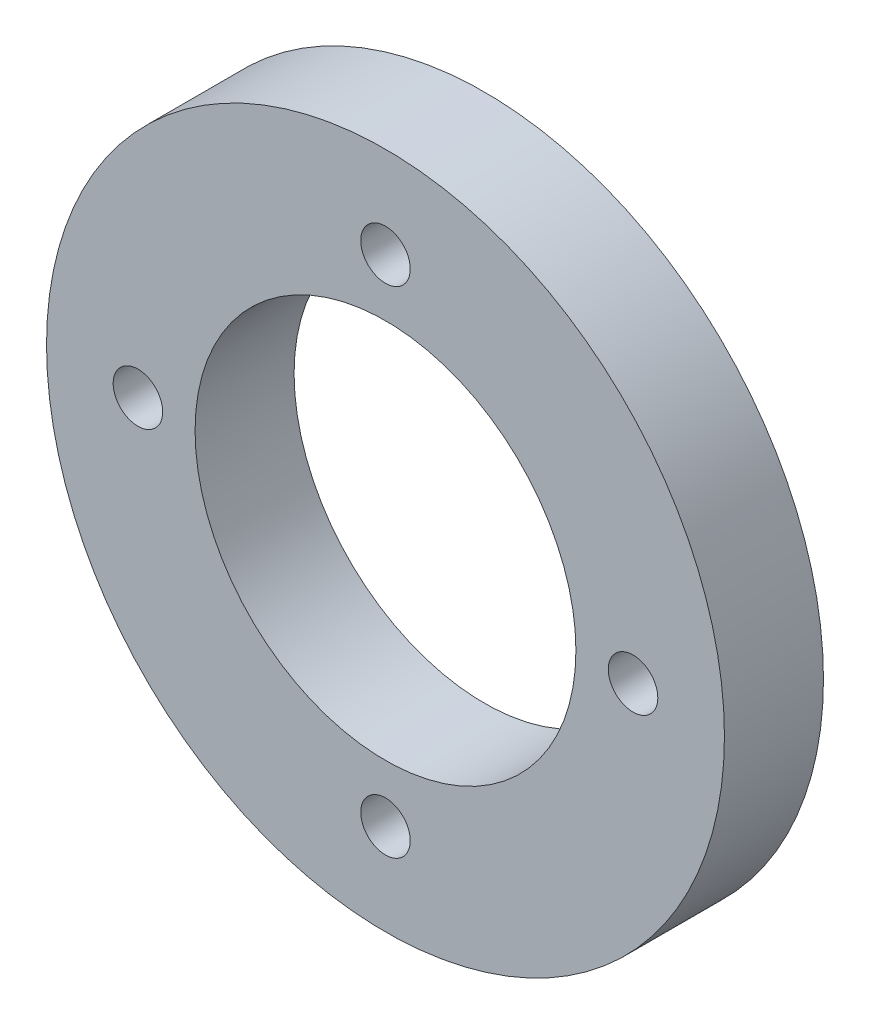
ISO-10303-21;
HEADER;
FILE_DESCRIPTION(('STEP AP214'),'2;1');
FILE_NAME('part.step','',(''),(''),'','','');
FILE_SCHEMA(('AUTOMOTIVE_DESIGN { 1 0 10303 214 1 1 1 1 }'));
ENDSEC;
DATA;
#1=APPLICATION_CONTEXT('core data for automotive mechanical design processes');
#2=APPLICATION_PROTOCOL_DEFINITION('international standard','automotive_design',2000,#1);
#3=PRODUCT_CONTEXT('',#1,'mechanical');
#4=PRODUCT('Part','Part','',(#3));
#5=PRODUCT_RELATED_PRODUCT_CATEGORY('part','',(#4));
#6=PRODUCT_DEFINITION_FORMATION('','',#4);
#7=PRODUCT_DEFINITION_CONTEXT('part definition',#1,'design');
#8=PRODUCT_DEFINITION('design','',#6,#7);
#9=PRODUCT_DEFINITION_SHAPE('','',#8);
#10=(LENGTH_UNIT() NAMED_UNIT(*) SI_UNIT(.MILLI.,.METRE.));
#11=(NAMED_UNIT(*) PLANE_ANGLE_UNIT() SI_UNIT($,.RADIAN.));
#12=(NAMED_UNIT(*) SI_UNIT($,.STERADIAN.) SOLID_ANGLE_UNIT());
#13=UNCERTAINTY_MEASURE_WITH_UNIT(LENGTH_MEASURE(1.E-05),#10,'distance_accuracy_value','');
#14=(GEOMETRIC_REPRESENTATION_CONTEXT(3) GLOBAL_UNCERTAINTY_ASSIGNED_CONTEXT((#13)) GLOBAL_UNIT_ASSIGNED_CONTEXT((#10,
#11,#12)) REPRESENTATION_CONTEXT('',''));
#15=CARTESIAN_POINT('',(0.,0.,0.));
#16=DIRECTION('',(0.,0.,1.));
#17=DIRECTION('',(1.,0.,0.));
#18=AXIS2_PLACEMENT_3D('',#15,#16,#17);
#19=CARTESIAN_POINT('',(0.,0.,5.2));
#20=DIRECTION('',(0.,0.,1.));
#21=DIRECTION('',(1.,0.,0.));
#22=AXIS2_PLACEMENT_3D('',#19,#20,#21);
#23=PLANE('',#22);
#24=CARTESIAN_POINT('',(7.35780363512721E-13,-13.,5.2));
#25=DIRECTION('',(0.,0.,1.));
#26=DIRECTION('',(1.,0.,0.));
#27=AXIS2_PLACEMENT_3D('',#24,#25,#26);
#28=CIRCLE('',#27,1.30000000000079);
#29=CARTESIAN_POINT('',(1.30000000000153,-13.,5.2));
#30=VERTEX_POINT('',#29);
#31=EDGE_CURVE('E60',#30,#30,#28,.T.);
#32=ORIENTED_EDGE('',*,*,#31,.F.);
#33=EDGE_LOOP('',(#32));
#34=FACE_BOUND('',#33,.T.);
#35=CARTESIAN_POINT('',(0.,13.,5.2));
#36=DIRECTION('',(0.,0.,1.));
#37=DIRECTION('',(1.,0.,0.));
#38=AXIS2_PLACEMENT_3D('',#35,#36,#37);
#39=CIRCLE('',#38,1.3);
#40=CARTESIAN_POINT('',(1.3,13.,5.2));
#41=VERTEX_POINT('',#40);
#42=EDGE_CURVE('E48',#41,#41,#39,.T.);
#43=ORIENTED_EDGE('',*,*,#42,.F.);
#44=EDGE_LOOP('',(#43));
#45=FACE_BOUND('',#44,.T.);
#46=CARTESIAN_POINT('',(0.,0.,5.2));
#47=DIRECTION('',(0.,0.,1.));
#48=DIRECTION('',(1.,0.,0.));
#49=AXIS2_PLACEMENT_3D('',#46,#47,#48);
#50=CIRCLE('',#49,17.8);
#51=CARTESIAN_POINT('',(17.8,0.,5.2));
#52=VERTEX_POINT('',#51);
#53=EDGE_CURVE('E10',#52,#52,#50,.T.);
#54=ORIENTED_EDGE('',*,*,#53,.T.);
#55=EDGE_LOOP('',(#54));
#56=FACE_BOUND('',#55,.T.);
#57=CARTESIAN_POINT('',(0.,0.,5.2));
#58=DIRECTION('',(0.,0.,1.));
#59=DIRECTION('',(1.,0.,0.));
#60=AXIS2_PLACEMENT_3D('',#57,#58,#59);
#61=CIRCLE('',#60,10.);
#62=CARTESIAN_POINT('',(10.,0.,5.2));
#63=VERTEX_POINT('',#62);
#64=EDGE_CURVE('E43',#63,#63,#61,.T.);
#65=ORIENTED_EDGE('',*,*,#64,.F.);
#66=EDGE_LOOP('',(#65));
#67=FACE_BOUND('',#66,.T.);
#68=CARTESIAN_POINT('',(13.0000000000004,3.67890181756361E-13,5.2));
#69=DIRECTION('',(0.,0.,1.));
#70=DIRECTION('',(1.,0.,0.));
#71=AXIS2_PLACEMENT_3D('',#68,#69,#70);
#72=CIRCLE('',#71,1.30000000000029);
#73=CARTESIAN_POINT('',(14.3000000000007,3.67890181756361E-13,5.2));
#74=VERTEX_POINT('',#73);
#75=EDGE_CURVE('E54',#74,#74,#72,.T.);
#76=ORIENTED_EDGE('',*,*,#75,.F.);
#77=EDGE_LOOP('',(#76));
#78=FACE_BOUND('',#77,.T.);
#79=CARTESIAN_POINT('',(-12.9999999999996,-3.69482222595252E-13,5.2));
#80=DIRECTION('',(0.,0.,1.));
#81=DIRECTION('',(1.,0.,0.));
#82=AXIS2_PLACEMENT_3D('',#79,#80,#81);
#83=CIRCLE('',#82,1.30000000000059);
#84=CARTESIAN_POINT('',(-11.699999999999,-3.69482222595252E-13,5.2));
#85=VERTEX_POINT('',#84);
#86=EDGE_CURVE('E66',#85,#85,#83,.T.);
#87=ORIENTED_EDGE('',*,*,#86,.F.);
#88=EDGE_LOOP('',(#87));
#89=FACE_BOUND('',#88,.T.);
#90=ADVANCED_FACE('F32',(#34,#45,#56,#67,#78,#89),#23,.T.);
#91=CARTESIAN_POINT('',(0.,0.,0.));
#92=DIRECTION('',(0.,0.,1.));
#93=DIRECTION('',(1.,0.,0.));
#94=AXIS2_PLACEMENT_3D('',#91,#92,#93);
#95=PLANE('',#94);
#96=CARTESIAN_POINT('',(0.,0.,0.));
#97=DIRECTION('',(0.,0.,1.));
#98=DIRECTION('',(1.,0.,0.));
#99=AXIS2_PLACEMENT_3D('',#96,#97,#98);
#100=CIRCLE('',#99,17.8);
#101=CARTESIAN_POINT('',(17.8,0.,0.));
#102=VERTEX_POINT('',#101);
#103=EDGE_CURVE('E36',#102,#102,#100,.T.);
#104=ORIENTED_EDGE('',*,*,#103,.F.);
#105=EDGE_LOOP('',(#104));
#106=FACE_BOUND('',#105,.T.);
#107=CARTESIAN_POINT('',(0.,0.,0.));
#108=DIRECTION('',(0.,0.,1.));
#109=DIRECTION('',(1.,0.,0.));
#110=AXIS2_PLACEMENT_3D('',#107,#108,#109);
#111=CIRCLE('',#110,10.);
#112=CARTESIAN_POINT('',(10.,0.,0.));
#113=VERTEX_POINT('',#112);
#114=EDGE_CURVE('E45',#113,#113,#111,.T.);
#115=ORIENTED_EDGE('',*,*,#114,.T.);
#116=EDGE_LOOP('',(#115));
#117=FACE_BOUND('',#116,.T.);
#118=CARTESIAN_POINT('',(0.,13.,0.));
#119=DIRECTION('',(0.,0.,1.));
#120=DIRECTION('',(1.,0.,0.));
#121=AXIS2_PLACEMENT_3D('',#118,#119,#120);
#122=CIRCLE('',#121,1.3);
#123=CARTESIAN_POINT('',(1.3,13.,0.));
#124=VERTEX_POINT('',#123);
#125=EDGE_CURVE('E51',#124,#124,#122,.T.);
#126=ORIENTED_EDGE('',*,*,#125,.T.);
#127=EDGE_LOOP('',(#126));
#128=FACE_BOUND('',#127,.T.);
#129=CARTESIAN_POINT('',(13.0000000000004,3.67890181756361E-13,0.));
#130=DIRECTION('',(0.,0.,1.));
#131=DIRECTION('',(1.,0.,0.));
#132=AXIS2_PLACEMENT_3D('',#129,#130,#131);
#133=CIRCLE('',#132,1.30000000000029);
#134=CARTESIAN_POINT('',(14.3000000000007,3.67890181756361E-13,0.));
#135=VERTEX_POINT('',#134);
#136=EDGE_CURVE('E57',#135,#135,#133,.T.);
#137=ORIENTED_EDGE('',*,*,#136,.T.);
#138=EDGE_LOOP('',(#137));
#139=FACE_BOUND('',#138,.T.);
#140=CARTESIAN_POINT('',(7.35780363512721E-13,-13.,0.));
#141=DIRECTION('',(0.,0.,1.));
#142=DIRECTION('',(1.,0.,0.));
#143=AXIS2_PLACEMENT_3D('',#140,#141,#142);
#144=CIRCLE('',#143,1.30000000000079);
#145=CARTESIAN_POINT('',(1.30000000000153,-13.,0.));
#146=VERTEX_POINT('',#145);
#147=EDGE_CURVE('E63',#146,#146,#144,.T.);
#148=ORIENTED_EDGE('',*,*,#147,.T.);
#149=EDGE_LOOP('',(#148));
#150=FACE_BOUND('',#149,.T.);
#151=CARTESIAN_POINT('',(-12.9999999999996,-3.69482222595252E-13,0.));
#152=DIRECTION('',(0.,0.,1.));
#153=DIRECTION('',(1.,0.,0.));
#154=AXIS2_PLACEMENT_3D('',#151,#152,#153);
#155=CIRCLE('',#154,1.30000000000059);
#156=CARTESIAN_POINT('',(-11.699999999999,-3.69482222595252E-13,0.));
#157=VERTEX_POINT('',#156);
#158=EDGE_CURVE('E69',#157,#157,#155,.T.);
#159=ORIENTED_EDGE('',*,*,#158,.T.);
#160=EDGE_LOOP('',(#159));
#161=FACE_BOUND('',#160,.T.);
#162=ADVANCED_FACE('F79',(#106,#117,#128,#139,#150,#161),#95,.F.);
#163=CARTESIAN_POINT('',(0.,0.,5.2));
#164=DIRECTION('',(0.,0.,-1.));
#165=DIRECTION('',(-1.,0.,0.));
#166=AXIS2_PLACEMENT_3D('',#163,#164,#165);
#167=CYLINDRICAL_SURFACE('',#166,17.8);
#168=ORIENTED_EDGE('',*,*,#53,.F.);
#169=EDGE_LOOP('',(#168));
#170=FACE_BOUND('',#169,.T.);
#171=ORIENTED_EDGE('',*,*,#103,.T.);
#172=EDGE_LOOP('',(#171));
#173=FACE_BOUND('',#172,.T.);
#174=ADVANCED_FACE('F34',(#170,#173),#167,.T.);
#175=CARTESIAN_POINT('',(0.,0.,5.2));
#176=DIRECTION('',(0.,0.,-1.));
#177=DIRECTION('',(-1.,0.,0.));
#178=AXIS2_PLACEMENT_3D('',#175,#176,#177);
#179=CYLINDRICAL_SURFACE('',#178,10.);
#180=ORIENTED_EDGE('',*,*,#64,.T.);
#181=EDGE_LOOP('',(#180));
#182=FACE_BOUND('',#181,.T.);
#183=ORIENTED_EDGE('',*,*,#114,.F.);
#184=EDGE_LOOP('',(#183));
#185=FACE_BOUND('',#184,.T.);
#186=ADVANCED_FACE('F89',(#182,#185),#179,.F.);
#187=CARTESIAN_POINT('',(0.,13.,5.2));
#188=DIRECTION('',(0.,0.,-1.));
#189=DIRECTION('',(-1.,0.,0.));
#190=AXIS2_PLACEMENT_3D('',#187,#188,#189);
#191=CYLINDRICAL_SURFACE('',#190,1.3);
#192=ORIENTED_EDGE('',*,*,#42,.T.);
#193=EDGE_LOOP('',(#192));
#194=FACE_BOUND('',#193,.T.);
#195=ORIENTED_EDGE('',*,*,#125,.F.);
#196=EDGE_LOOP('',(#195));
#197=FACE_BOUND('',#196,.T.);
#198=ADVANCED_FACE('F92',(#194,#197),#191,.F.);
#199=CARTESIAN_POINT('',(13.0000000000004,3.67890181756361E-13,5.2));
#200=DIRECTION('',(0.,0.,-1.));
#201=DIRECTION('',(-1.,0.,0.));
#202=AXIS2_PLACEMENT_3D('',#199,#200,#201);
#203=CYLINDRICAL_SURFACE('',#202,1.30000000000029);
#204=ORIENTED_EDGE('',*,*,#75,.T.);
#205=EDGE_LOOP('',(#204));
#206=FACE_BOUND('',#205,.T.);
#207=ORIENTED_EDGE('',*,*,#136,.F.);
#208=EDGE_LOOP('',(#207));
#209=FACE_BOUND('',#208,.T.);
#210=ADVANCED_FACE('F96',(#206,#209),#203,.F.);
#211=CARTESIAN_POINT('',(7.35780363512721E-13,-13.,5.2));
#212=DIRECTION('',(0.,0.,-1.));
#213=DIRECTION('',(-1.,0.,0.));
#214=AXIS2_PLACEMENT_3D('',#211,#212,#213);
#215=CYLINDRICAL_SURFACE('',#214,1.30000000000079);
#216=ORIENTED_EDGE('',*,*,#31,.T.);
#217=EDGE_LOOP('',(#216));
#218=FACE_BOUND('',#217,.T.);
#219=ORIENTED_EDGE('',*,*,#147,.F.);
#220=EDGE_LOOP('',(#219));
#221=FACE_BOUND('',#220,.T.);
#222=ADVANCED_FACE('F100',(#218,#221),#215,.F.);
#223=CARTESIAN_POINT('',(-12.9999999999996,-3.69482222595252E-13,5.2));
#224=DIRECTION('',(0.,0.,-1.));
#225=DIRECTION('',(-1.,0.,0.));
#226=AXIS2_PLACEMENT_3D('',#223,#224,#225);
#227=CYLINDRICAL_SURFACE('',#226,1.30000000000059);
#228=ORIENTED_EDGE('',*,*,#86,.T.);
#229=EDGE_LOOP('',(#228));
#230=FACE_BOUND('',#229,.T.);
#231=ORIENTED_EDGE('',*,*,#158,.F.);
#232=EDGE_LOOP('',(#231));
#233=FACE_BOUND('',#232,.T.);
#234=ADVANCED_FACE('F75',(#230,#233),#227,.F.);
#235=CLOSED_SHELL('',(#90,#162,#174,#186,#198,#210,#222,#234));
#236=MANIFOLD_SOLID_BREP('B2',#235);
#237=ADVANCED_BREP_SHAPE_REPRESENTATION('',(#18,#236),#14);
#238=SHAPE_DEFINITION_REPRESENTATION(#9,#237);
ENDSEC;
END-ISO-10303-21;
